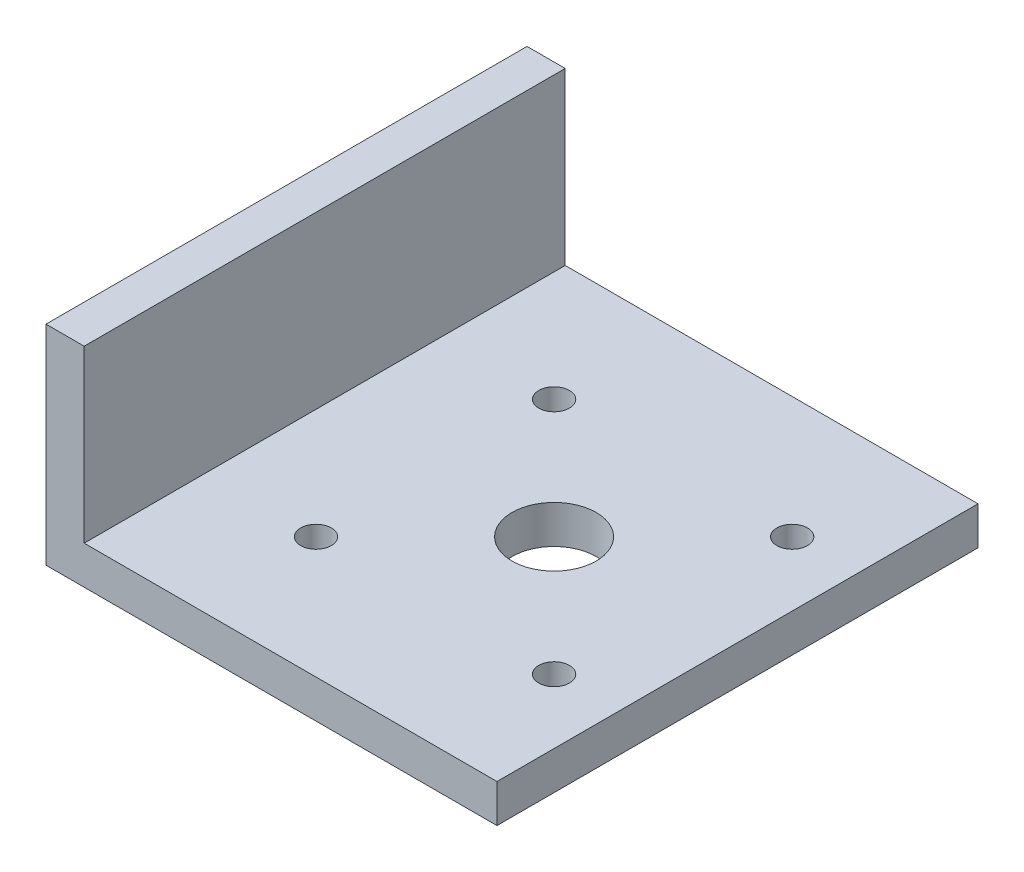
ISO-10303-21;
HEADER;
FILE_DESCRIPTION(('STEP AP214'),'2;1');
FILE_NAME('part.step','',(''),(''),'','','');
FILE_SCHEMA(('AUTOMOTIVE_DESIGN { 1 0 10303 214 1 1 1 1 }'));
ENDSEC;
DATA;
#1=APPLICATION_CONTEXT('core data for automotive mechanical design processes');
#2=APPLICATION_PROTOCOL_DEFINITION('international standard','automotive_design',2000,#1);
#3=PRODUCT_CONTEXT('',#1,'mechanical');
#4=PRODUCT('Part','Part','',(#3));
#5=PRODUCT_RELATED_PRODUCT_CATEGORY('part','',(#4));
#6=PRODUCT_DEFINITION_FORMATION('','',#4);
#7=PRODUCT_DEFINITION_CONTEXT('part definition',#1,'design');
#8=PRODUCT_DEFINITION('design','',#6,#7);
#9=PRODUCT_DEFINITION_SHAPE('','',#8);
#10=(LENGTH_UNIT() NAMED_UNIT(*) SI_UNIT(.MILLI.,.METRE.));
#11=(NAMED_UNIT(*) PLANE_ANGLE_UNIT() SI_UNIT($,.RADIAN.));
#12=(NAMED_UNIT(*) SI_UNIT($,.STERADIAN.) SOLID_ANGLE_UNIT());
#13=UNCERTAINTY_MEASURE_WITH_UNIT(LENGTH_MEASURE(1.E-05),#10,'distance_accuracy_value','');
#14=(GEOMETRIC_REPRESENTATION_CONTEXT(3) GLOBAL_UNCERTAINTY_ASSIGNED_CONTEXT((#13)) GLOBAL_UNIT_ASSIGNED_CONTEXT((#10,
#11,#12)) REPRESENTATION_CONTEXT('',''));
#15=CARTESIAN_POINT('',(0.,0.,0.));
#16=DIRECTION('',(0.,0.,1.));
#17=DIRECTION('',(1.,0.,0.));
#18=AXIS2_PLACEMENT_3D('',#15,#16,#17);
#19=CARTESIAN_POINT('',(75.,-37.5,80.));
#20=DIRECTION('',(0.,1.,0.));
#21=DIRECTION('',(0.,0.,1.));
#22=AXIS2_PLACEMENT_3D('',#19,#20,#21);
#23=PLANE('',#22);
#24=CARTESIAN_POINT('',(24.7010101267766,-37.5,20.2010101267767));
#25=DIRECTION('',(0.,1.,0.));
#26=DIRECTION('',(0.,0.,1.));
#27=AXIS2_PLACEMENT_3D('',#24,#25,#26);
#28=CIRCLE('',#27,2.55);
#29=CARTESIAN_POINT('',(24.7010101267766,-37.5,22.7510101267767));
#30=VERTEX_POINT('',#29);
#31=EDGE_CURVE('E164',#30,#30,#28,.T.);
#32=ORIENTED_EDGE('',*,*,#31,.T.);
#33=EDGE_LOOP('',(#32));
#34=FACE_BOUND('',#33,.T.);
#35=CARTESIAN_POINT('',(24.7010101267766,-37.5,59.7989898732233));
#36=DIRECTION('',(0.,1.,0.));
#37=DIRECTION('',(0.,0.,1.));
#38=AXIS2_PLACEMENT_3D('',#35,#36,#37);
#39=CIRCLE('',#38,2.54999999999999);
#40=CARTESIAN_POINT('',(24.7010101267766,-37.5,62.3489898732233));
#41=VERTEX_POINT('',#40);
#42=EDGE_CURVE('E170',#41,#41,#39,.T.);
#43=ORIENTED_EDGE('',*,*,#42,.T.);
#44=EDGE_LOOP('',(#43));
#45=FACE_BOUND('',#44,.T.);
#46=CARTESIAN_POINT('',(64.2989898732233,-37.5,59.7989898732233));
#47=DIRECTION('',(0.,1.,0.));
#48=DIRECTION('',(0.,0.,1.));
#49=AXIS2_PLACEMENT_3D('',#46,#47,#48);
#50=CIRCLE('',#49,2.54999999999999);
#51=CARTESIAN_POINT('',(64.2989898732233,-37.5,62.3489898732233));
#52=VERTEX_POINT('',#51);
#53=EDGE_CURVE('E176',#52,#52,#50,.T.);
#54=ORIENTED_EDGE('',*,*,#53,.T.);
#55=EDGE_LOOP('',(#54));
#56=FACE_BOUND('',#55,.T.);
#57=CARTESIAN_POINT('',(64.2989898732233,-37.5,20.2010101267767));
#58=DIRECTION('',(0.,1.,0.));
#59=DIRECTION('',(0.,0.,1.));
#60=AXIS2_PLACEMENT_3D('',#57,#58,#59);
#61=CIRCLE('',#60,2.54999999999999);
#62=CARTESIAN_POINT('',(64.2989898732233,-37.5,22.7510101267767));
#63=VERTEX_POINT('',#62);
#64=EDGE_CURVE('E141',#63,#63,#61,.T.);
#65=ORIENTED_EDGE('',*,*,#64,.T.);
#66=EDGE_LOOP('',(#65));
#67=FACE_BOUND('',#66,.T.);
#68=CARTESIAN_POINT('',(44.5,-37.5,40.));
#69=DIRECTION('',(0.,-1.,0.));
#70=DIRECTION('',(0.,0.,-1.));
#71=AXIS2_PLACEMENT_3D('',#68,#69,#70);
#72=CIRCLE('',#71,7.);
#73=CARTESIAN_POINT('',(44.5,-37.5,33.));
#74=VERTEX_POINT('',#73);
#75=EDGE_CURVE('E137',#74,#74,#72,.T.);
#76=ORIENTED_EDGE('',*,*,#75,.F.);
#77=EDGE_LOOP('',(#76));
#78=FACE_BOUND('',#77,.T.);
#79=DIRECTION('',(1.,0.,0.));
#80=VECTOR('',#79,1.);
#81=CARTESIAN_POINT('',(75.,-37.5,0.));
#82=LINE('',#81,#80);
#83=CARTESIAN_POINT('',(0.,-37.5,0.));
#84=VERTEX_POINT('',#83);
#85=CARTESIAN_POINT('',(75.,-37.5,0.));
#86=VERTEX_POINT('',#85);
#87=EDGE_CURVE('E119',#84,#86,#82,.T.);
#88=ORIENTED_EDGE('',*,*,#87,.T.);
#89=DIRECTION('',(0.,0.,-1.));
#90=VECTOR('',#89,1.);
#91=CARTESIAN_POINT('',(75.,-37.5,80.));
#92=LINE('',#91,#90);
#93=CARTESIAN_POINT('',(75.,-37.5,80.));
#94=VERTEX_POINT('',#93);
#95=EDGE_CURVE('E42',#94,#86,#92,.T.);
#96=ORIENTED_EDGE('',*,*,#95,.F.);
#97=DIRECTION('',(1.,0.,0.));
#98=VECTOR('',#97,1.);
#99=CARTESIAN_POINT('',(75.,-37.5,80.));
#100=LINE('',#99,#98);
#101=CARTESIAN_POINT('',(0.,-37.5,80.));
#102=VERTEX_POINT('',#101);
#103=EDGE_CURVE('E129',#102,#94,#100,.T.);
#104=ORIENTED_EDGE('',*,*,#103,.F.);
#105=DIRECTION('',(0.,0.,-1.));
#106=VECTOR('',#105,1.);
#107=CARTESIAN_POINT('',(0.,-37.5,80.));
#108=LINE('',#107,#106);
#109=EDGE_CURVE('E114',#102,#84,#108,.T.);
#110=ORIENTED_EDGE('',*,*,#109,.T.);
#111=EDGE_LOOP('',(#88,#96,#104,#110));
#112=FACE_BOUND('',#111,.T.);
#113=ADVANCED_FACE('F35',(#34,#45,#56,#67,#78,#112),#23,.F.);
#114=CARTESIAN_POINT('',(75.,-31.15,80.));
#115=DIRECTION('',(-1.,0.,0.));
#116=DIRECTION('',(0.,-1.,0.));
#117=AXIS2_PLACEMENT_3D('',#114,#115,#116);
#118=PLANE('',#117);
#119=DIRECTION('',(0.,1.,0.));
#120=VECTOR('',#119,1.);
#121=CARTESIAN_POINT('',(75.,-31.15,0.));
#122=LINE('',#121,#120);
#123=CARTESIAN_POINT('',(75.,-31.15,0.));
#124=VERTEX_POINT('',#123);
#125=EDGE_CURVE('E122',#86,#124,#122,.T.);
#126=ORIENTED_EDGE('',*,*,#125,.T.);
#127=DIRECTION('',(0.,0.,-1.));
#128=VECTOR('',#127,1.);
#129=CARTESIAN_POINT('',(75.,-31.15,80.));
#130=LINE('',#129,#128);
#131=CARTESIAN_POINT('',(75.,-31.15,80.));
#132=VERTEX_POINT('',#131);
#133=EDGE_CURVE('E133',#132,#124,#130,.T.);
#134=ORIENTED_EDGE('',*,*,#133,.F.);
#135=DIRECTION('',(0.,1.,0.));
#136=VECTOR('',#135,1.);
#137=CARTESIAN_POINT('',(75.,-31.15,80.));
#138=LINE('',#137,#136);
#139=EDGE_CURVE('E87',#94,#132,#138,.T.);
#140=ORIENTED_EDGE('',*,*,#139,.F.);
#141=ORIENTED_EDGE('',*,*,#95,.T.);
#142=EDGE_LOOP('',(#126,#134,#140,#141));
#143=FACE_BOUND('',#142,.T.);
#144=ADVANCED_FACE('F152',(#143),#118,.F.);
#145=CARTESIAN_POINT('',(6.35000000000001,-31.15,80.));
#146=DIRECTION('',(0.,-1.,0.));
#147=DIRECTION('',(0.,0.,-1.));
#148=AXIS2_PLACEMENT_3D('',#145,#146,#147);
#149=PLANE('',#148);
#150=CARTESIAN_POINT('',(24.7010101267766,-31.15,20.2010101267767));
#151=DIRECTION('',(0.,1.,0.));
#152=DIRECTION('',(0.,0.,1.));
#153=AXIS2_PLACEMENT_3D('',#150,#151,#152);
#154=CIRCLE('',#153,2.55);
#155=CARTESIAN_POINT('',(24.7010101267766,-31.15,22.7510101267767));
#156=VERTEX_POINT('',#155);
#157=EDGE_CURVE('E98',#156,#156,#154,.T.);
#158=ORIENTED_EDGE('',*,*,#157,.F.);
#159=EDGE_LOOP('',(#158));
#160=FACE_BOUND('',#159,.T.);
#161=CARTESIAN_POINT('',(24.7010101267766,-31.15,59.7989898732233));
#162=DIRECTION('',(0.,1.,0.));
#163=DIRECTION('',(0.,0.,1.));
#164=AXIS2_PLACEMENT_3D('',#161,#162,#163);
#165=CIRCLE('',#164,2.54999999999999);
#166=CARTESIAN_POINT('',(24.7010101267766,-31.15,62.3489898732233));
#167=VERTEX_POINT('',#166);
#168=EDGE_CURVE('E167',#167,#167,#165,.T.);
#169=ORIENTED_EDGE('',*,*,#168,.F.);
#170=EDGE_LOOP('',(#169));
#171=FACE_BOUND('',#170,.T.);
#172=CARTESIAN_POINT('',(64.2989898732233,-31.15,59.7989898732233));
#173=DIRECTION('',(0.,1.,0.));
#174=DIRECTION('',(0.,0.,1.));
#175=AXIS2_PLACEMENT_3D('',#172,#173,#174);
#176=CIRCLE('',#175,2.54999999999999);
#177=CARTESIAN_POINT('',(64.2989898732233,-31.15,62.3489898732233));
#178=VERTEX_POINT('',#177);
#179=EDGE_CURVE('E173',#178,#178,#176,.T.);
#180=ORIENTED_EDGE('',*,*,#179,.F.);
#181=EDGE_LOOP('',(#180));
#182=FACE_BOUND('',#181,.T.);
#183=CARTESIAN_POINT('',(64.2989898732233,-31.15,20.2010101267767));
#184=DIRECTION('',(0.,1.,0.));
#185=DIRECTION('',(0.,0.,1.));
#186=AXIS2_PLACEMENT_3D('',#183,#184,#185);
#187=CIRCLE('',#186,2.54999999999999);
#188=CARTESIAN_POINT('',(64.2989898732233,-31.15,22.7510101267767));
#189=VERTEX_POINT('',#188);
#190=EDGE_CURVE('E146',#189,#189,#187,.T.);
#191=ORIENTED_EDGE('',*,*,#190,.F.);
#192=EDGE_LOOP('',(#191));
#193=FACE_BOUND('',#192,.T.);
#194=CARTESIAN_POINT('',(44.5,-31.15,40.));
#195=DIRECTION('',(0.,-1.,0.));
#196=DIRECTION('',(0.,0.,-1.));
#197=AXIS2_PLACEMENT_3D('',#194,#195,#196);
#198=CIRCLE('',#197,7.);
#199=CARTESIAN_POINT('',(44.5,-31.15,33.));
#200=VERTEX_POINT('',#199);
#201=EDGE_CURVE('E123',#200,#200,#198,.T.);
#202=ORIENTED_EDGE('',*,*,#201,.T.);
#203=EDGE_LOOP('',(#202));
#204=FACE_BOUND('',#203,.T.);
#205=DIRECTION('',(-1.,0.,0.));
#206=VECTOR('',#205,1.);
#207=CARTESIAN_POINT('',(6.35000000000001,-31.15,0.));
#208=LINE('',#207,#206);
#209=CARTESIAN_POINT('',(6.35000000000001,-31.15,0.));
#210=VERTEX_POINT('',#209);
#211=EDGE_CURVE('E125',#124,#210,#208,.T.);
#212=ORIENTED_EDGE('',*,*,#211,.T.);
#213=DIRECTION('',(0.,0.,-1.));
#214=VECTOR('',#213,1.);
#215=CARTESIAN_POINT('',(6.35000000000001,-31.15,80.));
#216=LINE('',#215,#214);
#217=CARTESIAN_POINT('',(6.35000000000001,-31.15,80.));
#218=VERTEX_POINT('',#217);
#219=EDGE_CURVE('E131',#218,#210,#216,.T.);
#220=ORIENTED_EDGE('',*,*,#219,.F.);
#221=DIRECTION('',(-1.,0.,0.));
#222=VECTOR('',#221,1.);
#223=CARTESIAN_POINT('',(6.35000000000001,-31.15,80.));
#224=LINE('',#223,#222);
#225=EDGE_CURVE('E111',#132,#218,#224,.T.);
#226=ORIENTED_EDGE('',*,*,#225,.F.);
#227=ORIENTED_EDGE('',*,*,#133,.T.);
#228=EDGE_LOOP('',(#212,#220,#226,#227));
#229=FACE_BOUND('',#228,.T.);
#230=ADVANCED_FACE('F155',(#160,#171,#182,#193,#204,#229),#149,.F.);
#231=CARTESIAN_POINT('',(6.35000000000001,31.15,80.));
#232=DIRECTION('',(-1.,0.,0.));
#233=DIRECTION('',(0.,0.,1.));
#234=AXIS2_PLACEMENT_3D('',#231,#232,#233);
#235=PLANE('',#234);
#236=DIRECTION('',(0.,1.,0.));
#237=VECTOR('',#236,1.);
#238=CARTESIAN_POINT('',(6.35000000000001,31.15,0.));
#239=LINE('',#238,#237);
#240=CARTESIAN_POINT('',(6.35000000000001,-2.77546837767773,0.));
#241=VERTEX_POINT('',#240);
#242=EDGE_CURVE('E107',#210,#241,#239,.T.);
#243=ORIENTED_EDGE('',*,*,#242,.T.);
#244=DIRECTION('',(0.,0.,-1.));
#245=VECTOR('',#244,1.);
#246=CARTESIAN_POINT('',(6.35000000000001,-2.77546837767769,-110.059120816356));
#247=LINE('',#246,#245);
#248=CARTESIAN_POINT('',(6.35000000000001,-2.77546837767772,80.));
#249=VERTEX_POINT('',#248);
#250=EDGE_CURVE('E48',#249,#241,#247,.T.);
#251=ORIENTED_EDGE('',*,*,#250,.F.);
#252=DIRECTION('',(0.,1.,0.));
#253=VECTOR('',#252,1.);
#254=CARTESIAN_POINT('',(6.35000000000001,31.15,80.));
#255=LINE('',#254,#253);
#256=EDGE_CURVE('E105',#218,#249,#255,.T.);
#257=ORIENTED_EDGE('',*,*,#256,.F.);
#258=ORIENTED_EDGE('',*,*,#219,.T.);
#259=EDGE_LOOP('',(#243,#251,#257,#258));
#260=FACE_BOUND('',#259,.T.);
#261=ADVANCED_FACE('F103',(#260),#235,.F.);
#262=CARTESIAN_POINT('',(0.,-37.5,80.));
#263=DIRECTION('',(1.,0.,0.));
#264=DIRECTION('',(0.,0.,-1.));
#265=AXIS2_PLACEMENT_3D('',#262,#263,#264);
#266=PLANE('',#265);
#267=DIRECTION('',(0.,-1.,0.));
#268=VECTOR('',#267,1.);
#269=CARTESIAN_POINT('',(0.,-37.5,80.));
#270=LINE('',#269,#268);
#271=CARTESIAN_POINT('',(0.,-2.77546837767771,80.));
#272=VERTEX_POINT('',#271);
#273=EDGE_CURVE('E57',#272,#102,#270,.T.);
#274=ORIENTED_EDGE('',*,*,#273,.F.);
#275=DIRECTION('',(0.,0.,-1.));
#276=VECTOR('',#275,1.);
#277=CARTESIAN_POINT('',(0.,-2.77546837767771,80.));
#278=LINE('',#277,#276);
#279=CARTESIAN_POINT('',(0.,-2.77546837767771,0.));
#280=VERTEX_POINT('',#279);
#281=EDGE_CURVE('E96',#272,#280,#278,.T.);
#282=ORIENTED_EDGE('',*,*,#281,.T.);
#283=DIRECTION('',(0.,-1.,0.));
#284=VECTOR('',#283,1.);
#285=CARTESIAN_POINT('',(0.,-37.5,0.));
#286=LINE('',#285,#284);
#287=EDGE_CURVE('E79',#280,#84,#286,.T.);
#288=ORIENTED_EDGE('',*,*,#287,.T.);
#289=ORIENTED_EDGE('',*,*,#109,.F.);
#290=EDGE_LOOP('',(#274,#282,#288,#289));
#291=FACE_BOUND('',#290,.T.);
#292=ADVANCED_FACE('F159',(#291),#266,.F.);
#293=CARTESIAN_POINT('',(0.,0.,80.));
#294=DIRECTION('',(0.,0.,-1.));
#295=DIRECTION('',(-1.,0.,0.));
#296=AXIS2_PLACEMENT_3D('',#293,#294,#295);
#297=PLANE('',#296);
#298=ORIENTED_EDGE('',*,*,#256,.T.);
#299=DIRECTION('',(-1.,0.,0.));
#300=VECTOR('',#299,1.);
#301=CARTESIAN_POINT('',(0.,-2.77546837767772,80.));
#302=LINE('',#301,#300);
#303=EDGE_CURVE('E94',#249,#272,#302,.T.);
#304=ORIENTED_EDGE('',*,*,#303,.T.);
#305=ORIENTED_EDGE('',*,*,#273,.T.);
#306=ORIENTED_EDGE('',*,*,#103,.T.);
#307=ORIENTED_EDGE('',*,*,#139,.T.);
#308=ORIENTED_EDGE('',*,*,#225,.T.);
#309=EDGE_LOOP('',(#298,#304,#305,#306,#307,#308));
#310=FACE_BOUND('',#309,.T.);
#311=ADVANCED_FACE('F109',(#310),#297,.F.);
#312=CARTESIAN_POINT('',(0.,0.,0.));
#313=DIRECTION('',(0.,0.,-1.));
#314=DIRECTION('',(-1.,0.,0.));
#315=AXIS2_PLACEMENT_3D('',#312,#313,#314);
#316=PLANE('',#315);
#317=DIRECTION('',(-1.,0.,0.));
#318=VECTOR('',#317,1.);
#319=CARTESIAN_POINT('',(0.,-2.77546837767771,0.));
#320=LINE('',#319,#318);
#321=EDGE_CURVE('E11',#241,#280,#320,.T.);
#322=ORIENTED_EDGE('',*,*,#321,.F.);
#323=ORIENTED_EDGE('',*,*,#242,.F.);
#324=ORIENTED_EDGE('',*,*,#211,.F.);
#325=ORIENTED_EDGE('',*,*,#125,.F.);
#326=ORIENTED_EDGE('',*,*,#87,.F.);
#327=ORIENTED_EDGE('',*,*,#287,.F.);
#328=EDGE_LOOP('',(#322,#323,#324,#325,#326,#327));
#329=FACE_BOUND('',#328,.T.);
#330=ADVANCED_FACE('F157',(#329),#316,.T.);
#331=CARTESIAN_POINT('',(44.5,-27.5,40.));
#332=DIRECTION('',(0.,-1.,0.));
#333=DIRECTION('',(0.,0.,-1.));
#334=AXIS2_PLACEMENT_3D('',#331,#332,#333);
#335=CYLINDRICAL_SURFACE('',#334,7.);
#336=ORIENTED_EDGE('',*,*,#75,.T.);
#337=EDGE_LOOP('',(#336));
#338=FACE_BOUND('',#337,.T.);
#339=ORIENTED_EDGE('',*,*,#201,.F.);
#340=EDGE_LOOP('',(#339));
#341=FACE_BOUND('',#340,.T.);
#342=ADVANCED_FACE('F209',(#338,#341),#335,.F.);
#343=CARTESIAN_POINT('',(64.2989898732233,-41.15,20.2010101267767));
#344=DIRECTION('',(0.,1.,0.));
#345=DIRECTION('',(0.,0.,1.));
#346=AXIS2_PLACEMENT_3D('',#343,#344,#345);
#347=CYLINDRICAL_SURFACE('',#346,2.54999999999999);
#348=ORIENTED_EDGE('',*,*,#190,.T.);
#349=EDGE_LOOP('',(#348));
#350=FACE_BOUND('',#349,.T.);
#351=ORIENTED_EDGE('',*,*,#64,.F.);
#352=EDGE_LOOP('',(#351));
#353=FACE_BOUND('',#352,.T.);
#354=ADVANCED_FACE('F181',(#350,#353),#347,.F.);
#355=CARTESIAN_POINT('',(64.2989898732233,-41.15,59.7989898732233));
#356=DIRECTION('',(0.,1.,0.));
#357=DIRECTION('',(0.,0.,1.));
#358=AXIS2_PLACEMENT_3D('',#355,#356,#357);
#359=CYLINDRICAL_SURFACE('',#358,2.54999999999999);
#360=ORIENTED_EDGE('',*,*,#179,.T.);
#361=EDGE_LOOP('',(#360));
#362=FACE_BOUND('',#361,.T.);
#363=ORIENTED_EDGE('',*,*,#53,.F.);
#364=EDGE_LOOP('',(#363));
#365=FACE_BOUND('',#364,.T.);
#366=ADVANCED_FACE('F208',(#362,#365),#359,.F.);
#367=CARTESIAN_POINT('',(24.7010101267766,-41.15,59.7989898732233));
#368=DIRECTION('',(0.,1.,0.));
#369=DIRECTION('',(0.,0.,1.));
#370=AXIS2_PLACEMENT_3D('',#367,#368,#369);
#371=CYLINDRICAL_SURFACE('',#370,2.54999999999999);
#372=ORIENTED_EDGE('',*,*,#168,.T.);
#373=EDGE_LOOP('',(#372));
#374=FACE_BOUND('',#373,.T.);
#375=ORIENTED_EDGE('',*,*,#42,.F.);
#376=EDGE_LOOP('',(#375));
#377=FACE_BOUND('',#376,.T.);
#378=ADVANCED_FACE('F215',(#374,#377),#371,.F.);
#379=CARTESIAN_POINT('',(24.7010101267766,-41.15,20.2010101267767));
#380=DIRECTION('',(0.,1.,0.));
#381=DIRECTION('',(0.,0.,1.));
#382=AXIS2_PLACEMENT_3D('',#379,#380,#381);
#383=CYLINDRICAL_SURFACE('',#382,2.55);
#384=ORIENTED_EDGE('',*,*,#157,.T.);
#385=EDGE_LOOP('',(#384));
#386=FACE_BOUND('',#385,.T.);
#387=ORIENTED_EDGE('',*,*,#31,.F.);
#388=EDGE_LOOP('',(#387));
#389=FACE_BOUND('',#388,.T.);
#390=ADVANCED_FACE('F275',(#386,#389),#383,.F.);
#391=CARTESIAN_POINT('',(-3.64999999999999,-2.77546837767769,-110.059120816356));
#392=DIRECTION('',(0.,-1.,0.));
#393=DIRECTION('',(0.,0.,-1.));
#394=AXIS2_PLACEMENT_3D('',#391,#392,#393);
#395=PLANE('',#394);
#396=ORIENTED_EDGE('',*,*,#250,.T.);
#397=ORIENTED_EDGE('',*,*,#321,.T.);
#398=ORIENTED_EDGE('',*,*,#281,.F.);
#399=ORIENTED_EDGE('',*,*,#303,.F.);
#400=EDGE_LOOP('',(#396,#397,#398,#399));
#401=FACE_BOUND('',#400,.T.);
#402=ADVANCED_FACE('F95',(#401),#395,.F.);
#403=CLOSED_SHELL('',(#113,#144,#230,#261,#292,#311,#330,#342,#354,#366,#378,#390,#402));
#404=MANIFOLD_SOLID_BREP('B2',#403);
#405=ADVANCED_BREP_SHAPE_REPRESENTATION('',(#18,#404),#14);
#406=SHAPE_DEFINITION_REPRESENTATION(#9,#405);
ENDSEC;
END-ISO-10303-21;
